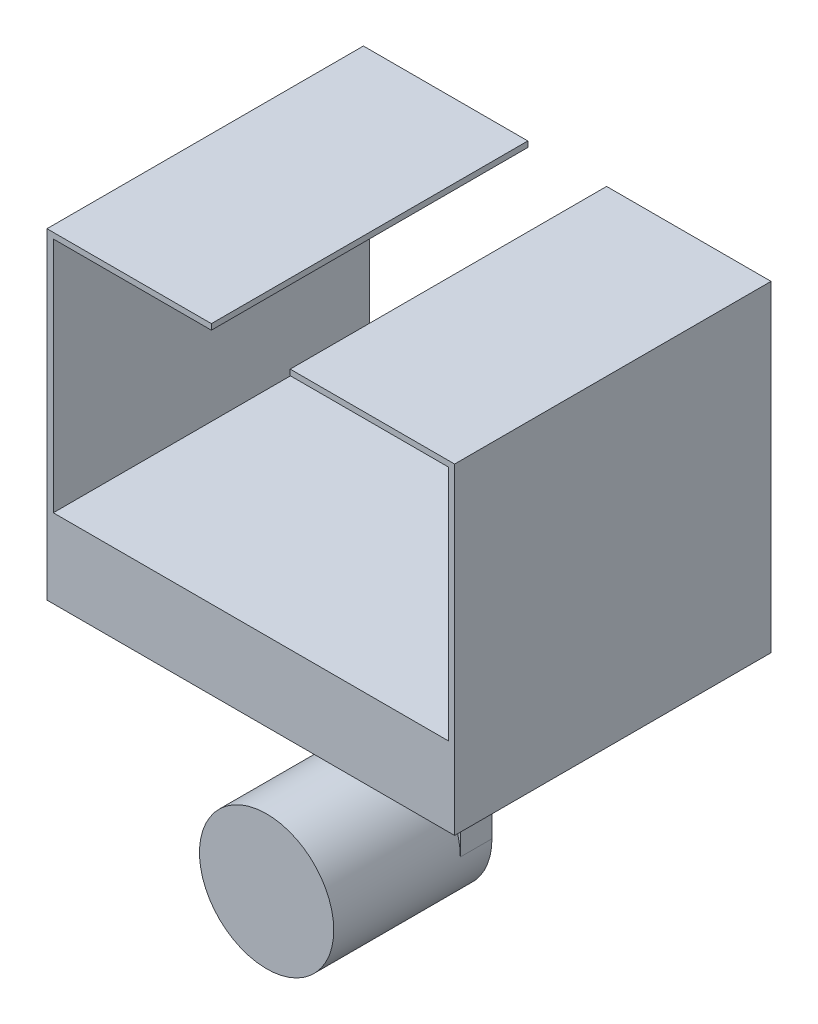
ISO-10303-21;
HEADER;
FILE_DESCRIPTION(('STEP AP214'),'2;1');
FILE_NAME('part.step','',(''),(''),'','','');
FILE_SCHEMA(('AUTOMOTIVE_DESIGN { 1 0 10303 214 1 1 1 1 }'));
ENDSEC;
DATA;
#1=APPLICATION_CONTEXT('core data for automotive mechanical design processes');
#2=APPLICATION_PROTOCOL_DEFINITION('international standard','automotive_design',2000,#1);
#3=PRODUCT_CONTEXT('',#1,'mechanical');
#4=PRODUCT('Part','Part','',(#3));
#5=PRODUCT_RELATED_PRODUCT_CATEGORY('part','',(#4));
#6=PRODUCT_DEFINITION_FORMATION('','',#4);
#7=PRODUCT_DEFINITION_CONTEXT('part definition',#1,'design');
#8=PRODUCT_DEFINITION('design','',#6,#7);
#9=PRODUCT_DEFINITION_SHAPE('','',#8);
#10=(LENGTH_UNIT() NAMED_UNIT(*) SI_UNIT(.MILLI.,.METRE.));
#11=(NAMED_UNIT(*) PLANE_ANGLE_UNIT() SI_UNIT($,.RADIAN.));
#12=(NAMED_UNIT(*) SI_UNIT($,.STERADIAN.) SOLID_ANGLE_UNIT());
#13=UNCERTAINTY_MEASURE_WITH_UNIT(LENGTH_MEASURE(1.E-05),#10,'distance_accuracy_value','');
#14=(GEOMETRIC_REPRESENTATION_CONTEXT(3) GLOBAL_UNCERTAINTY_ASSIGNED_CONTEXT((#13)) GLOBAL_UNIT_ASSIGNED_CONTEXT((#10,
#11,#12)) REPRESENTATION_CONTEXT('',''));
#15=CARTESIAN_POINT('',(0.,0.,0.));
#16=DIRECTION('',(0.,0.,1.));
#17=DIRECTION('',(1.,0.,0.));
#18=AXIS2_PLACEMENT_3D('',#15,#16,#17);
#19=CARTESIAN_POINT('',(-32.7209577851901,77.0394201761409,2.54));
#20=DIRECTION('',(0.,0.,-1.));
#21=DIRECTION('',(-1.,0.,0.));
#22=AXIS2_PLACEMENT_3D('',#19,#20,#21);
#23=PLANE('',#22);
#24=DIRECTION('',(0.,-1.,0.));
#25=VECTOR('',#24,1.);
#26=CARTESIAN_POINT('',(-6.3246,76.1238,2.53999999999999));
#27=LINE('',#26,#25);
#28=CARTESIAN_POINT('',(-6.3246,77.0394201761409,2.53999999999999));
#29=VERTEX_POINT('',#28);
#30=CARTESIAN_POINT('',(-6.3246,76.1238,2.53999999999999));
#31=VERTEX_POINT('',#30);
#32=EDGE_CURVE('E73',#29,#31,#27,.T.);
#33=ORIENTED_EDGE('',*,*,#32,.F.);
#34=DIRECTION('',(1.,0.,0.));
#35=VECTOR('',#34,1.);
#36=CARTESIAN_POINT('',(-32.7209577851901,77.0394201761409,2.54));
#37=LINE('',#36,#35);
#38=CARTESIAN_POINT('',(-32.7209577851901,77.0394201761409,2.54));
#39=VERTEX_POINT('',#38);
#40=EDGE_CURVE('E225',#39,#29,#37,.T.);
#41=ORIENTED_EDGE('',*,*,#40,.F.);
#42=DIRECTION('',(0.,-1.,0.));
#43=VECTOR('',#42,1.);
#44=CARTESIAN_POINT('',(-32.7209577851901,77.0394201761409,2.54));
#45=LINE('',#44,#43);
#46=CARTESIAN_POINT('',(-32.7209577851901,25.4,2.54));
#47=VERTEX_POINT('',#46);
#48=EDGE_CURVE('E250',#39,#47,#45,.T.);
#49=ORIENTED_EDGE('',*,*,#48,.T.);
#50=DIRECTION('',(1.,0.,0.));
#51=VECTOR('',#50,1.);
#52=CARTESIAN_POINT('',(-32.7209577851901,25.4,2.54));
#53=LINE('',#52,#51);
#54=CARTESIAN_POINT('',(32.7209577851901,25.4,2.53999999999998));
#55=VERTEX_POINT('',#54);
#56=EDGE_CURVE('E234',#47,#55,#53,.T.);
#57=ORIENTED_EDGE('',*,*,#56,.T.);
#58=DIRECTION('',(0.,-1.,0.));
#59=VECTOR('',#58,1.);
#60=CARTESIAN_POINT('',(32.7209577851901,77.0394201761409,2.53999999999998));
#61=LINE('',#60,#59);
#62=CARTESIAN_POINT('',(32.7209577851901,77.0394201761409,2.53999999999998));
#63=VERTEX_POINT('',#62);
#64=EDGE_CURVE('E242',#63,#55,#61,.T.);
#65=ORIENTED_EDGE('',*,*,#64,.F.);
#66=CARTESIAN_POINT('',(6.3246,77.0394201761409,2.53999999999999));
#67=VERTEX_POINT('',#66);
#68=EDGE_CURVE('E224',#67,#63,#37,.T.);
#69=ORIENTED_EDGE('',*,*,#68,.F.);
#70=DIRECTION('',(0.,1.,0.));
#71=VECTOR('',#70,1.);
#72=CARTESIAN_POINT('',(6.3246,76.1238,2.53999999999999));
#73=LINE('',#72,#71);
#74=CARTESIAN_POINT('',(6.3246,76.1238,2.53999999999999));
#75=VERTEX_POINT('',#74);
#76=EDGE_CURVE('E177',#75,#67,#73,.T.);
#77=ORIENTED_EDGE('',*,*,#76,.F.);
#78=DIRECTION('',(-1.,0.,0.));
#79=VECTOR('',#78,1.);
#80=CARTESIAN_POINT('',(-31.70428,76.1238,2.53999999999999));
#81=LINE('',#80,#79);
#82=CARTESIAN_POINT('',(31.70428,76.1238,2.53999999999999));
#83=VERTEX_POINT('',#82);
#84=EDGE_CURVE('E207',#83,#75,#81,.T.);
#85=ORIENTED_EDGE('',*,*,#84,.F.);
#86=DIRECTION('',(0.,1.,0.));
#87=VECTOR('',#86,1.);
#88=CARTESIAN_POINT('',(31.70428,38.0492,2.53999999999999));
#89=LINE('',#88,#87);
#90=CARTESIAN_POINT('',(31.70428,38.0492,2.53999999999999));
#91=VERTEX_POINT('',#90);
#92=EDGE_CURVE('E199',#91,#83,#89,.T.);
#93=ORIENTED_EDGE('',*,*,#92,.F.);
#94=DIRECTION('',(1.,0.,0.));
#95=VECTOR('',#94,1.);
#96=CARTESIAN_POINT('',(-31.70428,38.0492,2.53999999999999));
#97=LINE('',#96,#95);
#98=CARTESIAN_POINT('',(-31.70428,38.0492,2.54));
#99=VERTEX_POINT('',#98);
#100=EDGE_CURVE('E200',#99,#91,#97,.T.);
#101=ORIENTED_EDGE('',*,*,#100,.F.);
#102=DIRECTION('',(0.,-1.,0.));
#103=VECTOR('',#102,1.);
#104=CARTESIAN_POINT('',(-31.70428,38.0492,2.53999999999999));
#105=LINE('',#104,#103);
#106=CARTESIAN_POINT('',(-31.70428,76.1238,2.53999999999999));
#107=VERTEX_POINT('',#106);
#108=EDGE_CURVE('E195',#107,#99,#105,.T.);
#109=ORIENTED_EDGE('',*,*,#108,.F.);
#110=EDGE_CURVE('E202',#31,#107,#81,.T.);
#111=ORIENTED_EDGE('',*,*,#110,.F.);
#112=EDGE_LOOP('',(#33,#41,#49,#57,#65,#69,#77,#85,#93,#101,#109,#111));
#113=FACE_BOUND('',#112,.T.);
#114=ADVANCED_FACE('F51',(#113),#23,.F.);
#115=CARTESIAN_POINT('',(0.,77.0394201761409,0.));
#116=DIRECTION('',(0.,1.,0.));
#117=DIRECTION('',(0.,0.,1.));
#118=AXIS2_PLACEMENT_3D('',#115,#116,#117);
#119=PLANE('',#118);
#120=DIRECTION('',(-1.,0.,0.));
#121=VECTOR('',#120,1.);
#122=CARTESIAN_POINT('',(-32.7209577851901,77.0394201761409,-48.26));
#123=LINE('',#122,#121);
#124=CARTESIAN_POINT('',(32.7209577851901,77.0394201761409,-48.26));
#125=VERTEX_POINT('',#124);
#126=CARTESIAN_POINT('',(6.3246,77.0394201761409,-48.26));
#127=VERTEX_POINT('',#126);
#128=EDGE_CURVE('E226',#125,#127,#123,.T.);
#129=ORIENTED_EDGE('',*,*,#128,.T.);
#130=DIRECTION('',(0.,0.,1.));
#131=VECTOR('',#130,1.);
#132=CARTESIAN_POINT('',(6.3246,77.0394201761409,-48.26));
#133=LINE('',#132,#131);
#134=EDGE_CURVE('E463',#127,#67,#133,.T.);
#135=ORIENTED_EDGE('',*,*,#134,.T.);
#136=ORIENTED_EDGE('',*,*,#68,.T.);
#137=DIRECTION('',(0.,0.,-1.));
#138=VECTOR('',#137,1.);
#139=CARTESIAN_POINT('',(32.7209577851901,77.0394201761409,-48.26));
#140=LINE('',#139,#138);
#141=EDGE_CURVE('E228',#63,#125,#140,.T.);
#142=ORIENTED_EDGE('',*,*,#141,.T.);
#143=EDGE_LOOP('',(#129,#135,#136,#142));
#144=FACE_BOUND('',#143,.T.);
#145=ADVANCED_FACE('F295',(#144),#119,.T.);
#146=CARTESIAN_POINT('',(-31.70428,76.1238,-48.26));
#147=DIRECTION('',(0.,1.,0.));
#148=DIRECTION('',(-1.,0.,0.));
#149=AXIS2_PLACEMENT_3D('',#146,#147,#148);
#150=PLANE('',#149);
#151=DIRECTION('',(0.,0.,1.));
#152=VECTOR('',#151,1.);
#153=CARTESIAN_POINT('',(6.3246,76.1238,-48.26));
#154=LINE('',#153,#152);
#155=CARTESIAN_POINT('',(6.3246,76.1238,-48.26));
#156=VERTEX_POINT('',#155);
#157=EDGE_CURVE('E169',#156,#75,#154,.T.);
#158=ORIENTED_EDGE('',*,*,#157,.F.);
#159=DIRECTION('',(-1.,0.,0.));
#160=VECTOR('',#159,1.);
#161=CARTESIAN_POINT('',(-31.70428,76.1238,-48.26));
#162=LINE('',#161,#160);
#163=CARTESIAN_POINT('',(31.70428,76.1238,-48.26));
#164=VERTEX_POINT('',#163);
#165=EDGE_CURVE('E184',#164,#156,#162,.T.);
#166=ORIENTED_EDGE('',*,*,#165,.F.);
#167=DIRECTION('',(0.,0.,1.));
#168=VECTOR('',#167,1.);
#169=CARTESIAN_POINT('',(31.70428,76.1238,-48.26));
#170=LINE('',#169,#168);
#171=EDGE_CURVE('E212',#164,#83,#170,.T.);
#172=ORIENTED_EDGE('',*,*,#171,.T.);
#173=ORIENTED_EDGE('',*,*,#84,.T.);
#174=EDGE_LOOP('',(#158,#166,#172,#173));
#175=FACE_BOUND('',#174,.T.);
#176=ADVANCED_FACE('F284',(#175),#150,.F.);
#177=CARTESIAN_POINT('',(0.,0.,-25.4));
#178=DIRECTION('',(0.,0.,1.));
#179=DIRECTION('',(1.,0.,0.));
#180=AXIS2_PLACEMENT_3D('',#177,#178,#179);
#181=CYLINDRICAL_SURFACE('',#180,10.7775696863421);
#182=DIRECTION('',(0.,0.,-1.));
#183=VECTOR('',#182,1.);
#184=CARTESIAN_POINT('',(10.7775696863421,0.,-20.32));
#185=LINE('',#184,#183);
#186=CARTESIAN_POINT('',(10.7775696863421,0.,-20.32));
#187=VERTEX_POINT('',#186);
#188=CARTESIAN_POINT('',(10.7775696863421,0.,-25.4));
#189=VERTEX_POINT('',#188);
#190=EDGE_CURVE('E260',#187,#189,#185,.T.);
#191=ORIENTED_EDGE('',*,*,#190,.F.);
#192=CARTESIAN_POINT('',(0.,0.,-20.32));
#193=DIRECTION('',(0.,0.,-1.));
#194=DIRECTION('',(-1.,0.,0.));
#195=AXIS2_PLACEMENT_3D('',#192,#193,#194);
#196=CIRCLE('',#195,10.7775696863421);
#197=CARTESIAN_POINT('',(-10.7775696863421,0.,-20.32));
#198=VERTEX_POINT('',#197);
#199=EDGE_CURVE('E12',#187,#198,#196,.F.);
#200=ORIENTED_EDGE('',*,*,#199,.T.);
#201=DIRECTION('',(0.,0.,-1.));
#202=VECTOR('',#201,1.);
#203=CARTESIAN_POINT('',(-10.7775696863421,0.,-20.32));
#204=LINE('',#203,#202);
#205=CARTESIAN_POINT('',(-10.7775696863421,0.,-25.4));
#206=VERTEX_POINT('',#205);
#207=EDGE_CURVE('E271',#198,#206,#204,.T.);
#208=ORIENTED_EDGE('',*,*,#207,.T.);
#209=CARTESIAN_POINT('',(0.,0.,-25.4));
#210=DIRECTION('',(0.,0.,1.));
#211=DIRECTION('',(1.,0.,0.));
#212=AXIS2_PLACEMENT_3D('',#209,#210,#211);
#213=CIRCLE('',#212,10.7775696863421);
#214=EDGE_CURVE('E56',#206,#189,#213,.T.);
#215=ORIENTED_EDGE('',*,*,#214,.T.);
#216=EDGE_LOOP('',(#191,#200,#208,#215));
#217=FACE_BOUND('',#216,.T.);
#218=CARTESIAN_POINT('',(0.,0.,0.));
#219=DIRECTION('',(0.,0.,1.));
#220=DIRECTION('',(1.,0.,0.));
#221=AXIS2_PLACEMENT_3D('',#218,#219,#220);
#222=CIRCLE('',#221,10.7775696863421);
#223=CARTESIAN_POINT('',(10.7775696863421,0.,0.));
#224=VERTEX_POINT('',#223);
#225=EDGE_CURVE('E267',#224,#224,#222,.T.);
#226=ORIENTED_EDGE('',*,*,#225,.F.);
#227=EDGE_LOOP('',(#226));
#228=FACE_BOUND('',#227,.T.);
#229=ADVANCED_FACE('F52',(#217,#228),#181,.T.);
#230=CARTESIAN_POINT('',(0.,0.,-25.4));
#231=DIRECTION('',(0.,0.,1.));
#232=DIRECTION('',(1.,0.,0.));
#233=AXIS2_PLACEMENT_3D('',#230,#231,#232);
#234=PLANE('',#233);
#235=ORIENTED_EDGE('',*,*,#214,.F.);
#236=DIRECTION('',(0.,1.,0.));
#237=VECTOR('',#236,1.);
#238=CARTESIAN_POINT('',(-10.7775696863421,0.,-25.4));
#239=LINE('',#238,#237);
#240=CARTESIAN_POINT('',(-10.7775696863421,25.4,-25.4));
#241=VERTEX_POINT('',#240);
#242=EDGE_CURVE('E261',#206,#241,#239,.T.);
#243=ORIENTED_EDGE('',*,*,#242,.T.);
#244=DIRECTION('',(1.,0.,0.));
#245=VECTOR('',#244,1.);
#246=CARTESIAN_POINT('',(-10.7775696863421,25.4,-25.4));
#247=LINE('',#246,#245);
#248=CARTESIAN_POINT('',(10.7775696863421,25.4,-25.4));
#249=VERTEX_POINT('',#248);
#250=EDGE_CURVE('E253',#241,#249,#247,.T.);
#251=ORIENTED_EDGE('',*,*,#250,.T.);
#252=DIRECTION('',(0.,-1.,0.));
#253=VECTOR('',#252,1.);
#254=CARTESIAN_POINT('',(10.7775696863421,0.,-25.4));
#255=LINE('',#254,#253);
#256=EDGE_CURVE('E249',#249,#189,#255,.T.);
#257=ORIENTED_EDGE('',*,*,#256,.T.);
#258=EDGE_LOOP('',(#235,#243,#251,#257));
#259=FACE_BOUND('',#258,.T.);
#260=ADVANCED_FACE('F282',(#259),#234,.F.);
#261=CARTESIAN_POINT('',(0.,0.,0.));
#262=DIRECTION('',(0.,0.,1.));
#263=DIRECTION('',(1.,0.,0.));
#264=AXIS2_PLACEMENT_3D('',#261,#262,#263);
#265=PLANE('',#264);
#266=ORIENTED_EDGE('',*,*,#225,.T.);
#267=EDGE_LOOP('',(#266));
#268=FACE_BOUND('',#267,.T.);
#269=ADVANCED_FACE('F283',(#268),#265,.T.);
#270=CARTESIAN_POINT('',(10.7775696863421,0.,-20.32));
#271=DIRECTION('',(1.,0.,0.));
#272=DIRECTION('',(0.,0.,-1.));
#273=AXIS2_PLACEMENT_3D('',#270,#271,#272);
#274=PLANE('',#273);
#275=ORIENTED_EDGE('',*,*,#256,.F.);
#276=DIRECTION('',(0.,0.,-1.));
#277=VECTOR('',#276,1.);
#278=CARTESIAN_POINT('',(10.7775696863421,25.4,-20.32));
#279=LINE('',#278,#277);
#280=CARTESIAN_POINT('',(10.7775696863421,25.4,-20.32));
#281=VERTEX_POINT('',#280);
#282=EDGE_CURVE('E266',#281,#249,#279,.T.);
#283=ORIENTED_EDGE('',*,*,#282,.F.);
#284=DIRECTION('',(0.,-1.,0.));
#285=VECTOR('',#284,1.);
#286=CARTESIAN_POINT('',(10.7775696863421,0.,-20.32));
#287=LINE('',#286,#285);
#288=EDGE_CURVE('E252',#281,#187,#287,.T.);
#289=ORIENTED_EDGE('',*,*,#288,.T.);
#290=ORIENTED_EDGE('',*,*,#190,.T.);
#291=EDGE_LOOP('',(#275,#283,#289,#290));
#292=FACE_BOUND('',#291,.T.);
#293=ADVANCED_FACE('F322',(#292),#274,.T.);
#294=CARTESIAN_POINT('',(-10.7775696863421,0.,-20.32));
#295=DIRECTION('',(-1.,0.,0.));
#296=DIRECTION('',(0.,0.,1.));
#297=AXIS2_PLACEMENT_3D('',#294,#295,#296);
#298=PLANE('',#297);
#299=ORIENTED_EDGE('',*,*,#242,.F.);
#300=ORIENTED_EDGE('',*,*,#207,.F.);
#301=DIRECTION('',(0.,1.,0.));
#302=VECTOR('',#301,1.);
#303=CARTESIAN_POINT('',(-10.7775696863421,0.,-20.32));
#304=LINE('',#303,#302);
#305=CARTESIAN_POINT('',(-10.7775696863421,25.4,-20.32));
#306=VERTEX_POINT('',#305);
#307=EDGE_CURVE('E251',#198,#306,#304,.T.);
#308=ORIENTED_EDGE('',*,*,#307,.T.);
#309=DIRECTION('',(0.,0.,-1.));
#310=VECTOR('',#309,1.);
#311=CARTESIAN_POINT('',(-10.7775696863421,25.4,-20.32));
#312=LINE('',#311,#310);
#313=EDGE_CURVE('E272',#306,#241,#312,.T.);
#314=ORIENTED_EDGE('',*,*,#313,.T.);
#315=EDGE_LOOP('',(#299,#300,#308,#314));
#316=FACE_BOUND('',#315,.T.);
#317=ADVANCED_FACE('F316',(#316),#298,.T.);
#318=CARTESIAN_POINT('',(0.,0.,-20.32));
#319=DIRECTION('',(0.,0.,-1.));
#320=DIRECTION('',(-1.,0.,0.));
#321=AXIS2_PLACEMENT_3D('',#318,#319,#320);
#322=PLANE('',#321);
#323=ORIENTED_EDGE('',*,*,#199,.F.);
#324=ORIENTED_EDGE('',*,*,#288,.F.);
#325=DIRECTION('',(1.,0.,0.));
#326=VECTOR('',#325,1.);
#327=CARTESIAN_POINT('',(-10.7775696863421,25.4,-20.32));
#328=LINE('',#327,#326);
#329=EDGE_CURVE('E257',#306,#281,#328,.T.);
#330=ORIENTED_EDGE('',*,*,#329,.F.);
#331=ORIENTED_EDGE('',*,*,#307,.F.);
#332=EDGE_LOOP('',(#323,#324,#330,#331));
#333=FACE_BOUND('',#332,.T.);
#334=ADVANCED_FACE('F314',(#333),#322,.F.);
#335=CARTESIAN_POINT('',(-32.7209577851901,77.0394201761409,-48.26));
#336=DIRECTION('',(1.,0.,0.));
#337=DIRECTION('',(0.,0.,-1.));
#338=AXIS2_PLACEMENT_3D('',#335,#336,#337);
#339=PLANE('',#338);
#340=DIRECTION('',(0.,0.,1.));
#341=VECTOR('',#340,1.);
#342=CARTESIAN_POINT('',(-32.7209577851901,25.4,-48.26));
#343=LINE('',#342,#341);
#344=CARTESIAN_POINT('',(-32.7209577851901,25.4,-48.26));
#345=VERTEX_POINT('',#344);
#346=EDGE_CURVE('E211',#345,#47,#343,.T.);
#347=ORIENTED_EDGE('',*,*,#346,.T.);
#348=ORIENTED_EDGE('',*,*,#48,.F.);
#349=DIRECTION('',(0.,0.,1.));
#350=VECTOR('',#349,1.);
#351=CARTESIAN_POINT('',(-32.7209577851901,77.0394201761409,-48.26));
#352=LINE('',#351,#350);
#353=CARTESIAN_POINT('',(-32.7209577851901,77.0394201761409,-48.26));
#354=VERTEX_POINT('',#353);
#355=EDGE_CURVE('E216',#354,#39,#352,.T.);
#356=ORIENTED_EDGE('',*,*,#355,.F.);
#357=DIRECTION('',(0.,-1.,0.));
#358=VECTOR('',#357,1.);
#359=CARTESIAN_POINT('',(-32.7209577851901,77.0394201761409,-48.26));
#360=LINE('',#359,#358);
#361=EDGE_CURVE('E233',#354,#345,#360,.T.);
#362=ORIENTED_EDGE('',*,*,#361,.T.);
#363=EDGE_LOOP('',(#347,#348,#356,#362));
#364=FACE_BOUND('',#363,.T.);
#365=ADVANCED_FACE('F315',(#364),#339,.F.);
#366=CARTESIAN_POINT('',(32.7209577851901,77.0394201761409,-48.26));
#367=DIRECTION('',(-1.,0.,0.));
#368=DIRECTION('',(0.,0.,1.));
#369=AXIS2_PLACEMENT_3D('',#366,#367,#368);
#370=PLANE('',#369);
#371=DIRECTION('',(0.,0.,-1.));
#372=VECTOR('',#371,1.);
#373=CARTESIAN_POINT('',(32.7209577851901,25.4,-48.26));
#374=LINE('',#373,#372);
#375=CARTESIAN_POINT('',(32.7209577851901,25.4,-48.26));
#376=VERTEX_POINT('',#375);
#377=EDGE_CURVE('E236',#55,#376,#374,.T.);
#378=ORIENTED_EDGE('',*,*,#377,.T.);
#379=DIRECTION('',(0.,-1.,0.));
#380=VECTOR('',#379,1.);
#381=CARTESIAN_POINT('',(32.7209577851901,77.0394201761409,-48.26));
#382=LINE('',#381,#380);
#383=EDGE_CURVE('E241',#125,#376,#382,.T.);
#384=ORIENTED_EDGE('',*,*,#383,.F.);
#385=ORIENTED_EDGE('',*,*,#141,.F.);
#386=ORIENTED_EDGE('',*,*,#64,.T.);
#387=EDGE_LOOP('',(#378,#384,#385,#386));
#388=FACE_BOUND('',#387,.T.);
#389=ADVANCED_FACE('F309',(#388),#370,.F.);
#390=CARTESIAN_POINT('',(-32.7209577851901,77.0394201761409,-48.26));
#391=DIRECTION('',(0.,0.,1.));
#392=DIRECTION('',(1.,0.,0.));
#393=AXIS2_PLACEMENT_3D('',#390,#391,#392);
#394=PLANE('',#393);
#395=CARTESIAN_POINT('',(-6.3246,77.0394201761409,-48.26));
#396=VERTEX_POINT('',#395);
#397=EDGE_CURVE('E178',#396,#354,#123,.T.);
#398=ORIENTED_EDGE('',*,*,#397,.F.);
#399=DIRECTION('',(0.,-1.,0.));
#400=VECTOR('',#399,1.);
#401=CARTESIAN_POINT('',(-6.3246,76.1238,-48.26));
#402=LINE('',#401,#400);
#403=CARTESIAN_POINT('',(-6.3246,76.1238,-48.26));
#404=VERTEX_POINT('',#403);
#405=EDGE_CURVE('E165',#396,#404,#402,.T.);
#406=ORIENTED_EDGE('',*,*,#405,.T.);
#407=CARTESIAN_POINT('',(-31.70428,76.1238,-48.26));
#408=VERTEX_POINT('',#407);
#409=EDGE_CURVE('E174',#404,#408,#162,.T.);
#410=ORIENTED_EDGE('',*,*,#409,.T.);
#411=DIRECTION('',(0.,-1.,0.));
#412=VECTOR('',#411,1.);
#413=CARTESIAN_POINT('',(-31.70428,38.0492,-48.26));
#414=LINE('',#413,#412);
#415=CARTESIAN_POINT('',(-31.70428,38.0492,-48.26));
#416=VERTEX_POINT('',#415);
#417=EDGE_CURVE('E209',#408,#416,#414,.T.);
#418=ORIENTED_EDGE('',*,*,#417,.T.);
#419=DIRECTION('',(1.,0.,0.));
#420=VECTOR('',#419,1.);
#421=CARTESIAN_POINT('',(-31.70428,38.0492,-48.26));
#422=LINE('',#421,#420);
#423=CARTESIAN_POINT('',(31.70428,38.0492,-48.26));
#424=VERTEX_POINT('',#423);
#425=EDGE_CURVE('E191',#416,#424,#422,.T.);
#426=ORIENTED_EDGE('',*,*,#425,.T.);
#427=DIRECTION('',(0.,1.,0.));
#428=VECTOR('',#427,1.);
#429=CARTESIAN_POINT('',(31.70428,38.0492,-48.26));
#430=LINE('',#429,#428);
#431=EDGE_CURVE('E187',#424,#164,#430,.T.);
#432=ORIENTED_EDGE('',*,*,#431,.T.);
#433=ORIENTED_EDGE('',*,*,#165,.T.);
#434=DIRECTION('',(0.,1.,0.));
#435=VECTOR('',#434,1.);
#436=CARTESIAN_POINT('',(6.3246,76.1238,-48.26));
#437=LINE('',#436,#435);
#438=EDGE_CURVE('E68',#156,#127,#437,.T.);
#439=ORIENTED_EDGE('',*,*,#438,.T.);
#440=ORIENTED_EDGE('',*,*,#128,.F.);
#441=ORIENTED_EDGE('',*,*,#383,.T.);
#442=DIRECTION('',(-1.,0.,0.));
#443=VECTOR('',#442,1.);
#444=CARTESIAN_POINT('',(-32.7209577851901,25.4,-48.26));
#445=LINE('',#444,#443);
#446=EDGE_CURVE('E221',#376,#345,#445,.T.);
#447=ORIENTED_EDGE('',*,*,#446,.T.);
#448=ORIENTED_EDGE('',*,*,#361,.F.);
#449=EDGE_LOOP('',(#398,#406,#410,#418,#426,#432,#433,#439,#440,#441,#447,#448));
#450=FACE_BOUND('',#449,.T.);
#451=ADVANCED_FACE('F173',(#450),#394,.F.);
#452=DIRECTION('',(0.,0.,1.));
#453=VECTOR('',#452,1.);
#454=CARTESIAN_POINT('',(-6.3246,77.0394201761409,-48.26));
#455=LINE('',#454,#453);
#456=EDGE_CURVE('E196',#396,#29,#455,.T.);
#457=ORIENTED_EDGE('',*,*,#456,.F.);
#458=ORIENTED_EDGE('',*,*,#397,.T.);
#459=ORIENTED_EDGE('',*,*,#355,.T.);
#460=ORIENTED_EDGE('',*,*,#40,.T.);
#461=EDGE_LOOP('',(#457,#458,#459,#460));
#462=FACE_BOUND('',#461,.T.);
#463=ADVANCED_FACE('F310',(#462),#119,.T.);
#464=CARTESIAN_POINT('',(0.,25.4,0.));
#465=DIRECTION('',(0.,1.,0.));
#466=DIRECTION('',(0.,0.,1.));
#467=AXIS2_PLACEMENT_3D('',#464,#465,#466);
#468=PLANE('',#467);
#469=ORIENTED_EDGE('',*,*,#250,.F.);
#470=ORIENTED_EDGE('',*,*,#313,.F.);
#471=ORIENTED_EDGE('',*,*,#329,.T.);
#472=ORIENTED_EDGE('',*,*,#282,.T.);
#473=EDGE_LOOP('',(#469,#470,#471,#472));
#474=FACE_BOUND('',#473,.T.);
#475=ORIENTED_EDGE('',*,*,#346,.F.);
#476=ORIENTED_EDGE('',*,*,#446,.F.);
#477=ORIENTED_EDGE('',*,*,#377,.F.);
#478=ORIENTED_EDGE('',*,*,#56,.F.);
#479=EDGE_LOOP('',(#475,#476,#477,#478));
#480=FACE_BOUND('',#479,.T.);
#481=ADVANCED_FACE('F380',(#474,#480),#468,.F.);
#482=CARTESIAN_POINT('',(-31.70428,38.0492,-48.26));
#483=DIRECTION('',(-1.,0.,0.));
#484=DIRECTION('',(0.,-1.,0.));
#485=AXIS2_PLACEMENT_3D('',#482,#483,#484);
#486=PLANE('',#485);
#487=ORIENTED_EDGE('',*,*,#108,.T.);
#488=DIRECTION('',(0.,0.,1.));
#489=VECTOR('',#488,1.);
#490=CARTESIAN_POINT('',(-31.70428,38.0492,-48.26));
#491=LINE('',#490,#489);
#492=EDGE_CURVE('E186',#416,#99,#491,.T.);
#493=ORIENTED_EDGE('',*,*,#492,.F.);
#494=ORIENTED_EDGE('',*,*,#417,.F.);
#495=DIRECTION('',(0.,0.,1.));
#496=VECTOR('',#495,1.);
#497=CARTESIAN_POINT('',(-31.70428,76.1238,-48.26));
#498=LINE('',#497,#496);
#499=EDGE_CURVE('E182',#408,#107,#498,.T.);
#500=ORIENTED_EDGE('',*,*,#499,.T.);
#501=EDGE_LOOP('',(#487,#493,#494,#500));
#502=FACE_BOUND('',#501,.T.);
#503=ADVANCED_FACE('F382',(#502),#486,.F.);
#504=ORIENTED_EDGE('',*,*,#409,.F.);
#505=DIRECTION('',(0.,0.,1.));
#506=VECTOR('',#505,1.);
#507=CARTESIAN_POINT('',(-6.3246,76.1238,-48.26));
#508=LINE('',#507,#506);
#509=EDGE_CURVE('E163',#404,#31,#508,.T.);
#510=ORIENTED_EDGE('',*,*,#509,.T.);
#511=ORIENTED_EDGE('',*,*,#110,.T.);
#512=ORIENTED_EDGE('',*,*,#499,.F.);
#513=EDGE_LOOP('',(#504,#510,#511,#512));
#514=FACE_BOUND('',#513,.T.);
#515=ADVANCED_FACE('F181',(#514),#150,.F.);
#516=CARTESIAN_POINT('',(31.70428,38.0492,-48.26));
#517=DIRECTION('',(1.,0.,0.));
#518=DIRECTION('',(0.,1.,0.));
#519=AXIS2_PLACEMENT_3D('',#516,#517,#518);
#520=PLANE('',#519);
#521=ORIENTED_EDGE('',*,*,#92,.T.);
#522=ORIENTED_EDGE('',*,*,#171,.F.);
#523=ORIENTED_EDGE('',*,*,#431,.F.);
#524=DIRECTION('',(0.,0.,1.));
#525=VECTOR('',#524,1.);
#526=CARTESIAN_POINT('',(31.70428,38.0492,-48.26));
#527=LINE('',#526,#525);
#528=EDGE_CURVE('E213',#424,#91,#527,.T.);
#529=ORIENTED_EDGE('',*,*,#528,.T.);
#530=EDGE_LOOP('',(#521,#522,#523,#529));
#531=FACE_BOUND('',#530,.T.);
#532=ADVANCED_FACE('F396',(#531),#520,.F.);
#533=CARTESIAN_POINT('',(-31.70428,38.0492,-48.26));
#534=DIRECTION('',(0.,-1.,0.));
#535=DIRECTION('',(1.,0.,0.));
#536=AXIS2_PLACEMENT_3D('',#533,#534,#535);
#537=PLANE('',#536);
#538=ORIENTED_EDGE('',*,*,#100,.T.);
#539=ORIENTED_EDGE('',*,*,#528,.F.);
#540=ORIENTED_EDGE('',*,*,#425,.F.);
#541=ORIENTED_EDGE('',*,*,#492,.T.);
#542=EDGE_LOOP('',(#538,#539,#540,#541));
#543=FACE_BOUND('',#542,.T.);
#544=ADVANCED_FACE('F402',(#543),#537,.F.);
#545=CARTESIAN_POINT('',(6.3246,76.1238,-48.26));
#546=DIRECTION('',(1.,0.,0.));
#547=DIRECTION('',(0.,0.,-1.));
#548=AXIS2_PLACEMENT_3D('',#545,#546,#547);
#549=PLANE('',#548);
#550=ORIENTED_EDGE('',*,*,#76,.T.);
#551=ORIENTED_EDGE('',*,*,#134,.F.);
#552=ORIENTED_EDGE('',*,*,#438,.F.);
#553=ORIENTED_EDGE('',*,*,#157,.T.);
#554=EDGE_LOOP('',(#550,#551,#552,#553));
#555=FACE_BOUND('',#554,.T.);
#556=ADVANCED_FACE('F408',(#555),#549,.F.);
#557=CARTESIAN_POINT('',(-6.3246,76.1238,-48.26));
#558=DIRECTION('',(-1.,0.,0.));
#559=DIRECTION('',(0.,0.,1.));
#560=AXIS2_PLACEMENT_3D('',#557,#558,#559);
#561=PLANE('',#560);
#562=ORIENTED_EDGE('',*,*,#32,.T.);
#563=ORIENTED_EDGE('',*,*,#509,.F.);
#564=ORIENTED_EDGE('',*,*,#405,.F.);
#565=ORIENTED_EDGE('',*,*,#456,.T.);
#566=EDGE_LOOP('',(#562,#563,#564,#565));
#567=FACE_BOUND('',#566,.T.);
#568=ADVANCED_FACE('F161',(#567),#561,.F.);
#569=CLOSED_SHELL('',(#114,#145,#176,#229,#260,#269,#293,#317,#334,#365,#389,#451,#463,#481,
#503,#515,#532,#544,#556,#568));
#570=MANIFOLD_SOLID_BREP('B2',#569);
#571=ADVANCED_BREP_SHAPE_REPRESENTATION('',(#18,#570),#14);
#572=SHAPE_DEFINITION_REPRESENTATION(#9,#571);
ENDSEC;
END-ISO-10303-21;
